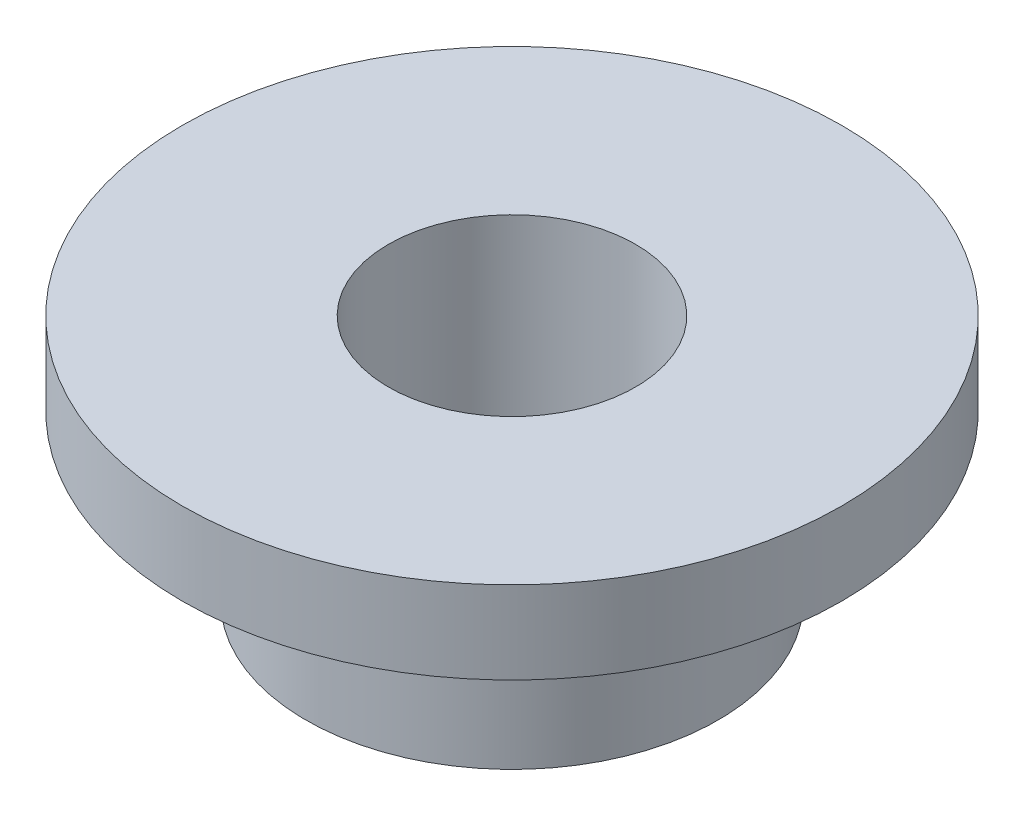
ISO-10303-21;
HEADER;
FILE_DESCRIPTION(('STEP AP214'),'2;1');
FILE_NAME('part.step','',(''),(''),'','','');
FILE_SCHEMA(('AUTOMOTIVE_DESIGN { 1 0 10303 214 1 1 1 1 }'));
ENDSEC;
DATA;
#1=APPLICATION_CONTEXT('core data for automotive mechanical design processes');
#2=APPLICATION_PROTOCOL_DEFINITION('international standard','automotive_design',2000,#1);
#3=PRODUCT_CONTEXT('',#1,'mechanical');
#4=PRODUCT('Part','Part','',(#3));
#5=PRODUCT_RELATED_PRODUCT_CATEGORY('part','',(#4));
#6=PRODUCT_DEFINITION_FORMATION('','',#4);
#7=PRODUCT_DEFINITION_CONTEXT('part definition',#1,'design');
#8=PRODUCT_DEFINITION('design','',#6,#7);
#9=PRODUCT_DEFINITION_SHAPE('','',#8);
#10=(LENGTH_UNIT() NAMED_UNIT(*) SI_UNIT(.MILLI.,.METRE.));
#11=(NAMED_UNIT(*) PLANE_ANGLE_UNIT() SI_UNIT($,.RADIAN.));
#12=(NAMED_UNIT(*) SI_UNIT($,.STERADIAN.) SOLID_ANGLE_UNIT());
#13=UNCERTAINTY_MEASURE_WITH_UNIT(LENGTH_MEASURE(1.E-05),#10,'distance_accuracy_value','');
#14=(GEOMETRIC_REPRESENTATION_CONTEXT(3) GLOBAL_UNCERTAINTY_ASSIGNED_CONTEXT((#13)) GLOBAL_UNIT_ASSIGNED_CONTEXT((#10,
#11,#12)) REPRESENTATION_CONTEXT('',''));
#15=CARTESIAN_POINT('',(0.,0.,0.));
#16=DIRECTION('',(0.,0.,1.));
#17=DIRECTION('',(1.,0.,0.));
#18=AXIS2_PLACEMENT_3D('',#15,#16,#17);
#19=CARTESIAN_POINT('',(0.,0.,0.));
#20=DIRECTION('',(0.,1.,0.));
#21=DIRECTION('',(-1.,0.,0.));
#22=AXIS2_PLACEMENT_3D('',#19,#20,#21);
#23=CYLINDRICAL_SURFACE('',#22,4.);
#24=CARTESIAN_POINT('',(0.,3.,0.));
#25=DIRECTION('',(0.,1.,0.));
#26=DIRECTION('',(-1.,0.,0.));
#27=AXIS2_PLACEMENT_3D('',#24,#25,#26);
#28=CIRCLE('',#27,4.);
#29=CARTESIAN_POINT('',(-4.,3.,0.));
#30=VERTEX_POINT('',#29);
#31=EDGE_CURVE('E52',#30,#30,#28,.T.);
#32=ORIENTED_EDGE('',*,*,#31,.F.);
#33=EDGE_LOOP('',(#32));
#34=FACE_BOUND('',#33,.T.);
#35=CARTESIAN_POINT('',(0.,2.,0.));
#36=DIRECTION('',(0.,1.,0.));
#37=DIRECTION('',(-1.,0.,0.));
#38=AXIS2_PLACEMENT_3D('',#35,#36,#37);
#39=CIRCLE('',#38,4.);
#40=CARTESIAN_POINT('',(-4.,2.,0.));
#41=VERTEX_POINT('',#40);
#42=EDGE_CURVE('E10',#41,#41,#39,.T.);
#43=ORIENTED_EDGE('',*,*,#42,.T.);
#44=EDGE_LOOP('',(#43));
#45=FACE_BOUND('',#44,.T.);
#46=ADVANCED_FACE('F30',(#34,#45),#23,.T.);
#47=CARTESIAN_POINT('',(0.,2.,0.));
#48=DIRECTION('',(0.,1.,0.));
#49=DIRECTION('',(-1.,0.,0.));
#50=AXIS2_PLACEMENT_3D('',#47,#48,#49);
#51=PLANE('',#50);
#52=ORIENTED_EDGE('',*,*,#42,.F.);
#53=EDGE_LOOP('',(#52));
#54=FACE_BOUND('',#53,.T.);
#55=CARTESIAN_POINT('',(0.,2.,0.));
#56=DIRECTION('',(0.,1.,0.));
#57=DIRECTION('',(-1.,0.,0.));
#58=AXIS2_PLACEMENT_3D('',#55,#56,#57);
#59=CIRCLE('',#58,2.5);
#60=CARTESIAN_POINT('',(-2.5,2.,0.));
#61=VERTEX_POINT('',#60);
#62=EDGE_CURVE('E36',#61,#61,#59,.T.);
#63=ORIENTED_EDGE('',*,*,#62,.T.);
#64=EDGE_LOOP('',(#63));
#65=FACE_BOUND('',#64,.T.);
#66=ADVANCED_FACE('F60',(#54,#65),#51,.F.);
#67=CARTESIAN_POINT('',(0.,0.,0.));
#68=DIRECTION('',(0.,1.,0.));
#69=DIRECTION('',(-1.,0.,0.));
#70=AXIS2_PLACEMENT_3D('',#67,#68,#69);
#71=CYLINDRICAL_SURFACE('',#70,2.5);
#72=ORIENTED_EDGE('',*,*,#62,.F.);
#73=EDGE_LOOP('',(#72));
#74=FACE_BOUND('',#73,.T.);
#75=CARTESIAN_POINT('',(0.,0.,0.));
#76=DIRECTION('',(0.,1.,0.));
#77=DIRECTION('',(-1.,0.,0.));
#78=AXIS2_PLACEMENT_3D('',#75,#76,#77);
#79=CIRCLE('',#78,2.5);
#80=CARTESIAN_POINT('',(-2.5,0.,0.));
#81=VERTEX_POINT('',#80);
#82=EDGE_CURVE('E40',#81,#81,#79,.T.);
#83=ORIENTED_EDGE('',*,*,#82,.T.);
#84=EDGE_LOOP('',(#83));
#85=FACE_BOUND('',#84,.T.);
#86=ADVANCED_FACE('F64',(#74,#85),#71,.T.);
#87=CARTESIAN_POINT('',(0.,0.,0.));
#88=DIRECTION('',(0.,-1.,0.));
#89=DIRECTION('',(1.,0.,0.));
#90=AXIS2_PLACEMENT_3D('',#87,#88,#89);
#91=PLANE('',#90);
#92=CARTESIAN_POINT('',(0.,0.,0.));
#93=DIRECTION('',(0.,1.,0.));
#94=DIRECTION('',(-1.,0.,0.));
#95=AXIS2_PLACEMENT_3D('',#92,#93,#94);
#96=CIRCLE('',#95,1.5);
#97=CARTESIAN_POINT('',(-1.5,0.,0.));
#98=VERTEX_POINT('',#97);
#99=EDGE_CURVE('E44',#98,#98,#96,.T.);
#100=ORIENTED_EDGE('',*,*,#99,.T.);
#101=EDGE_LOOP('',(#100));
#102=FACE_BOUND('',#101,.T.);
#103=ORIENTED_EDGE('',*,*,#82,.F.);
#104=EDGE_LOOP('',(#103));
#105=FACE_BOUND('',#104,.T.);
#106=ADVANCED_FACE('F69',(#102,#105),#91,.T.);
#107=CARTESIAN_POINT('',(0.,0.,0.));
#108=DIRECTION('',(0.,1.,0.));
#109=DIRECTION('',(-1.,0.,0.));
#110=AXIS2_PLACEMENT_3D('',#107,#108,#109);
#111=CYLINDRICAL_SURFACE('',#110,1.5);
#112=CARTESIAN_POINT('',(0.,3.,0.));
#113=DIRECTION('',(0.,1.,0.));
#114=DIRECTION('',(-1.,0.,0.));
#115=AXIS2_PLACEMENT_3D('',#112,#113,#114);
#116=CIRCLE('',#115,1.5);
#117=CARTESIAN_POINT('',(-1.5,3.,0.));
#118=VERTEX_POINT('',#117);
#119=EDGE_CURVE('E49',#118,#118,#116,.T.);
#120=ORIENTED_EDGE('',*,*,#119,.T.);
#121=EDGE_LOOP('',(#120));
#122=FACE_BOUND('',#121,.T.);
#123=ORIENTED_EDGE('',*,*,#99,.F.);
#124=EDGE_LOOP('',(#123));
#125=FACE_BOUND('',#124,.T.);
#126=ADVANCED_FACE('F75',(#122,#125),#111,.F.);
#127=CARTESIAN_POINT('',(0.,3.,0.));
#128=DIRECTION('',(0.,1.,0.));
#129=DIRECTION('',(-1.,0.,0.));
#130=AXIS2_PLACEMENT_3D('',#127,#128,#129);
#131=PLANE('',#130);
#132=ORIENTED_EDGE('',*,*,#31,.T.);
#133=EDGE_LOOP('',(#132));
#134=FACE_BOUND('',#133,.T.);
#135=ORIENTED_EDGE('',*,*,#119,.F.);
#136=EDGE_LOOP('',(#135));
#137=FACE_BOUND('',#136,.T.);
#138=ADVANCED_FACE('F56',(#134,#137),#131,.T.);
#139=CLOSED_SHELL('',(#46,#66,#86,#106,#126,#138));
#140=MANIFOLD_SOLID_BREP('B2',#139);
#141=ADVANCED_BREP_SHAPE_REPRESENTATION('',(#18,#140),#14);
#142=SHAPE_DEFINITION_REPRESENTATION(#9,#141);
ENDSEC;
END-ISO-10303-21;
